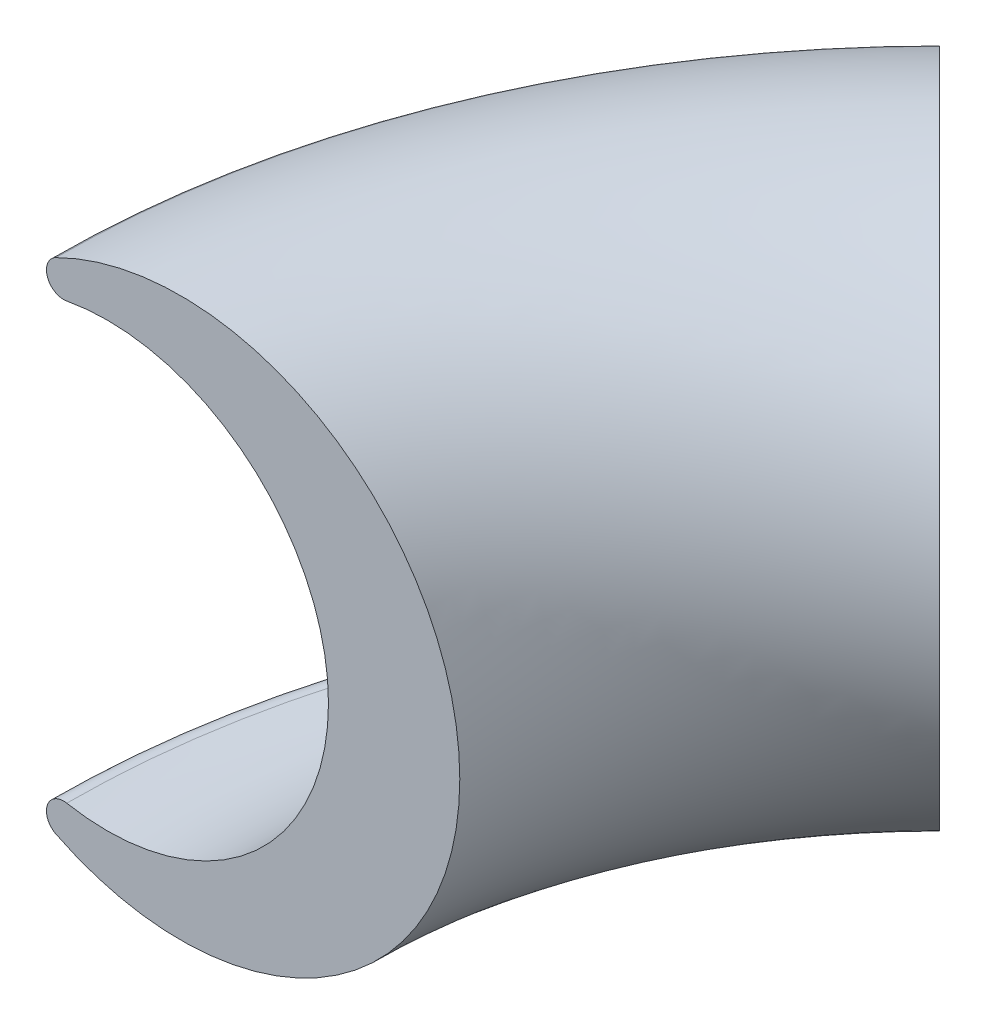
ISO-10303-21;
HEADER;
FILE_DESCRIPTION(('STEP AP214'),'2;1');
FILE_NAME('part.step','',(''),(''),'','','');
FILE_SCHEMA(('AUTOMOTIVE_DESIGN { 1 0 10303 214 1 1 1 1 }'));
ENDSEC;
DATA;
#1=APPLICATION_CONTEXT('core data for automotive mechanical design processes');
#2=APPLICATION_PROTOCOL_DEFINITION('international standard','automotive_design',2000,#1);
#3=PRODUCT_CONTEXT('',#1,'mechanical');
#4=PRODUCT('Part','Part','',(#3));
#5=PRODUCT_RELATED_PRODUCT_CATEGORY('part','',(#4));
#6=PRODUCT_DEFINITION_FORMATION('','',#4);
#7=PRODUCT_DEFINITION_CONTEXT('part definition',#1,'design');
#8=PRODUCT_DEFINITION('design','',#6,#7);
#9=PRODUCT_DEFINITION_SHAPE('','',#8);
#10=(LENGTH_UNIT() NAMED_UNIT(*) SI_UNIT(.MILLI.,.METRE.));
#11=(NAMED_UNIT(*) PLANE_ANGLE_UNIT() SI_UNIT($,.RADIAN.));
#12=(NAMED_UNIT(*) SI_UNIT($,.STERADIAN.) SOLID_ANGLE_UNIT());
#13=UNCERTAINTY_MEASURE_WITH_UNIT(LENGTH_MEASURE(1.E-05),#10,'distance_accuracy_value','');
#14=(GEOMETRIC_REPRESENTATION_CONTEXT(3) GLOBAL_UNCERTAINTY_ASSIGNED_CONTEXT((#13)) GLOBAL_UNIT_ASSIGNED_CONTEXT((#10,
#11,#12)) REPRESENTATION_CONTEXT('',''));
#15=CARTESIAN_POINT('',(0.,0.,0.));
#16=DIRECTION('',(0.,0.,1.));
#17=DIRECTION('',(1.,0.,0.));
#18=AXIS2_PLACEMENT_3D('',#15,#16,#17);
#19=CARTESIAN_POINT('',(6.5405,0.,0.));
#20=DIRECTION('',(0.,0.,1.));
#21=DIRECTION('',(1.,0.,0.));
#22=AXIS2_PLACEMENT_3D('',#19,#20,#21);
#23=PLANE('',#22);
#24=CARTESIAN_POINT('',(7.493,0.,0.));
#25=DIRECTION('',(0.,0.,1.));
#26=DIRECTION('',(1.,0.,0.));
#27=AXIS2_PLACEMENT_3D('',#24,#25,#26);
#28=CIRCLE('',#27,7.23955181390722);
#29=CARTESIAN_POINT('',(4.25524279646333,6.47518638783423,0.));
#30=VERTEX_POINT('',#29);
#31=CARTESIAN_POINT('',(4.25524279646331,-6.47518638783423,0.));
#32=VERTEX_POINT('',#31);
#33=EDGE_CURVE('E92',#30,#32,#28,.F.);
#34=ORIENTED_EDGE('',*,*,#33,.F.);
#35=CARTESIAN_POINT('',(4.45403729562105,6.07761752951579,0.));
#36=DIRECTION('',(0.,0.,1.));
#37=DIRECTION('',(1.,0.,0.));
#38=AXIS2_PLACEMENT_3D('',#35,#36,#37);
#39=CIRCLE('',#38,0.4445);
#40=CARTESIAN_POINT('',(4.53556522479152,5.64065821016766,0.));
#41=VERTEX_POINT('',#40);
#42=EDGE_CURVE('E48',#30,#41,#39,.T.);
#43=ORIENTED_EDGE('',*,*,#42,.T.);
#44=CARTESIAN_POINT('',(5.588,0.,0.));
#45=DIRECTION('',(0.,0.,1.));
#46=DIRECTION('',(1.,0.,0.));
#47=AXIS2_PLACEMENT_3D('',#44,#45,#46);
#48=CIRCLE('',#47,5.738);
#49=CARTESIAN_POINT('',(11.326,0.,0.));
#50=VERTEX_POINT('',#49);
#51=EDGE_CURVE('E91',#50,#41,#48,.T.);
#52=ORIENTED_EDGE('',*,*,#51,.F.);
#53=CARTESIAN_POINT('',(5.588,0.,0.));
#54=DIRECTION('',(0.,0.,-1.));
#55=DIRECTION('',(-1.,0.,0.));
#56=AXIS2_PLACEMENT_3D('',#53,#54,#55);
#57=CIRCLE('',#56,5.738);
#58=CARTESIAN_POINT('',(4.5355652247915,-5.64065821016766,0.));
#59=VERTEX_POINT('',#58);
#60=EDGE_CURVE('E85',#59,#50,#57,.F.);
#61=ORIENTED_EDGE('',*,*,#60,.F.);
#62=CARTESIAN_POINT('',(4.45403729562103,-6.07761752951578,0.));
#63=DIRECTION('',(0.,0.,1.));
#64=DIRECTION('',(1.,0.,0.));
#65=AXIS2_PLACEMENT_3D('',#62,#63,#64);
#66=CIRCLE('',#65,0.4445);
#67=EDGE_CURVE('E60',#59,#32,#66,.T.);
#68=ORIENTED_EDGE('',*,*,#67,.T.);
#69=EDGE_LOOP('',(#34,#43,#52,#61,#68));
#70=FACE_BOUND('',#69,.T.);
#71=ADVANCED_FACE('F39',(#70),#23,.T.);
#72=CARTESIAN_POINT('',(12.5850838032625,0.,-14.5929161967373));
#73=DIRECTION('',(-0.707106781186544,0.,0.707106781186551));
#74=DIRECTION('',(0.707106781186551,0.,0.707106781186544));
#75=AXIS2_PLACEMENT_3D('',#72,#73,#74);
#76=PLANE('',#75);
#77=CARTESIAN_POINT('',(11.9115645941824,0.,-15.2664354058175));
#78=DIRECTION('',(-0.707106781186544,0.,0.707106781186551));
#79=DIRECTION('',(0.707106781186551,0.,0.707106781186544));
#80=AXIS2_PLACEMENT_3D('',#77,#78,#79);
#81=CIRCLE('',#80,5.738);
#82=CARTESIAN_POINT('',(15.9689433046308,0.,-11.2090566953691));
#83=VERTEX_POINT('',#82);
#84=CARTESIAN_POINT('',(11.1673808278759,5.64065821016766,-16.0106191721239));
#85=VERTEX_POINT('',#84);
#86=EDGE_CURVE('E105',#83,#85,#81,.T.);
#87=ORIENTED_EDGE('',*,*,#86,.T.);
#88=CARTESIAN_POINT('',(11.1097318763034,6.07761752951579,-16.0682681236965));
#89=DIRECTION('',(-0.707106781186544,0.,0.707106781186551));
#90=DIRECTION('',(0.707106781186551,0.,0.707106781186544));
#91=AXIS2_PLACEMENT_3D('',#88,#89,#90);
#92=CIRCLE('',#91,0.4445);
#93=CARTESIAN_POINT('',(10.9691629378864,6.47518638783426,-16.2088370621135));
#94=VERTEX_POINT('',#93);
#95=EDGE_CURVE('E120',#85,#94,#92,.F.);
#96=ORIENTED_EDGE('',*,*,#95,.T.);
#97=CARTESIAN_POINT('',(13.2586030123427,0.,-13.9193969876571));
#98=DIRECTION('',(-0.707106781186544,0.,0.707106781186551));
#99=DIRECTION('',(0.707106781186551,0.,0.707106781186544));
#100=AXIS2_PLACEMENT_3D('',#97,#98,#99);
#101=CIRCLE('',#100,7.23955181390722);
#102=CARTESIAN_POINT('',(10.9691629378863,-6.47518638783423,-16.2088370621135));
#103=VERTEX_POINT('',#102);
#104=EDGE_CURVE('E100',#94,#103,#101,.F.);
#105=ORIENTED_EDGE('',*,*,#104,.T.);
#106=CARTESIAN_POINT('',(11.1097318763033,-6.07761752951578,-16.0682681236965));
#107=DIRECTION('',(-0.707106781186544,0.,0.707106781186551));
#108=DIRECTION('',(0.707106781186551,0.,0.707106781186544));
#109=AXIS2_PLACEMENT_3D('',#106,#107,#108);
#110=CIRCLE('',#109,0.4445);
#111=CARTESIAN_POINT('',(11.1673808278759,-5.64065821016766,-16.0106191721239));
#112=VERTEX_POINT('',#111);
#113=EDGE_CURVE('E117',#103,#112,#110,.F.);
#114=ORIENTED_EDGE('',*,*,#113,.T.);
#115=CARTESIAN_POINT('',(11.9115645941824,0.,-15.2664354058175));
#116=DIRECTION('',(0.707106781186544,0.,-0.707106781186551));
#117=DIRECTION('',(-0.707106781186551,0.,-0.707106781186544));
#118=AXIS2_PLACEMENT_3D('',#115,#116,#117);
#119=CIRCLE('',#118,5.738);
#120=EDGE_CURVE('E107',#112,#83,#119,.F.);
#121=ORIENTED_EDGE('',*,*,#120,.T.);
#122=EDGE_LOOP('',(#87,#96,#105,#114,#121));
#123=FACE_BOUND('',#122,.T.);
#124=ADVANCED_FACE('F143',(#123),#76,.F.);
#125=CARTESIAN_POINT('',(27.178,0.,0.));
#126=DIRECTION('',(0.,-1.,0.));
#127=DIRECTION('',(0.,0.,-1.));
#128=AXIS2_PLACEMENT_3D('',#125,#126,#127);
#129=TOROIDAL_SURFACE('',#128,19.685,7.23955181390722);
#130=ORIENTED_EDGE('',*,*,#104,.F.);
#131=CARTESIAN_POINT('',(27.178,6.47518638783426,0.));
#132=DIRECTION('',(0.,-1.,0.));
#133=DIRECTION('',(0.,0.,-1.));
#134=AXIS2_PLACEMENT_3D('',#131,#132,#133);
#135=CIRCLE('',#134,22.9227572035367);
#136=EDGE_CURVE('E127',#94,#30,#135,.F.);
#137=ORIENTED_EDGE('',*,*,#136,.T.);
#138=ORIENTED_EDGE('',*,*,#33,.T.);
#139=CARTESIAN_POINT('',(27.178,-6.47518638783426,0.));
#140=DIRECTION('',(0.,1.,0.));
#141=DIRECTION('',(0.,0.,1.));
#142=AXIS2_PLACEMENT_3D('',#139,#140,#141);
#143=CIRCLE('',#142,22.9227572035367);
#144=EDGE_CURVE('E123',#32,#103,#143,.F.);
#145=ORIENTED_EDGE('',*,*,#144,.T.);
#146=EDGE_LOOP('',(#130,#137,#138,#145));
#147=FACE_BOUND('',#146,.T.);
#148=ADVANCED_FACE('F135',(#147),#129,.T.);
#149=CARTESIAN_POINT('',(27.178,0.,0.));
#150=DIRECTION('',(0.,-1.,0.));
#151=DIRECTION('',(0.,0.,-1.));
#152=AXIS2_PLACEMENT_3D('',#149,#150,#151);
#153=TOROIDAL_SURFACE('',#152,21.59,5.738);
#154=ORIENTED_EDGE('',*,*,#120,.F.);
#155=CARTESIAN_POINT('',(27.178,-5.64065821016772,0.));
#156=DIRECTION('',(0.,1.,0.));
#157=DIRECTION('',(0.,0.,1.));
#158=AXIS2_PLACEMENT_3D('',#155,#156,#157);
#159=CIRCLE('',#158,22.6424347752085);
#160=EDGE_CURVE('E11',#112,#59,#159,.T.);
#161=ORIENTED_EDGE('',*,*,#160,.T.);
#162=ORIENTED_EDGE('',*,*,#60,.T.);
#163=CARTESIAN_POINT('',(27.178,0.,0.));
#164=DIRECTION('',(0.,-1.,0.));
#165=DIRECTION('',(-1.,0.,0.));
#166=AXIS2_PLACEMENT_3D('',#163,#164,#165);
#167=CIRCLE('',#166,15.852);
#168=EDGE_CURVE('E89',#50,#83,#167,.T.);
#169=ORIENTED_EDGE('',*,*,#168,.T.);
#170=EDGE_LOOP('',(#154,#161,#162,#169));
#171=FACE_BOUND('',#170,.T.);
#172=ADVANCED_FACE('F87',(#171),#153,.F.);
#173=CARTESIAN_POINT('',(27.178,0.,0.));
#174=DIRECTION('',(0.,-1.,0.));
#175=DIRECTION('',(0.,0.,-1.));
#176=AXIS2_PLACEMENT_3D('',#173,#174,#175);
#177=TOROIDAL_SURFACE('',#176,21.59,5.738);
#178=ORIENTED_EDGE('',*,*,#51,.T.);
#179=CARTESIAN_POINT('',(27.178,5.64065821016807,0.));
#180=DIRECTION('',(0.,-1.,0.));
#181=DIRECTION('',(0.,0.,-1.));
#182=AXIS2_PLACEMENT_3D('',#179,#180,#181);
#183=CIRCLE('',#182,22.6424347752086);
#184=EDGE_CURVE('E111',#41,#85,#183,.T.);
#185=ORIENTED_EDGE('',*,*,#184,.T.);
#186=ORIENTED_EDGE('',*,*,#86,.F.);
#187=ORIENTED_EDGE('',*,*,#168,.F.);
#188=EDGE_LOOP('',(#178,#185,#186,#187));
#189=FACE_BOUND('',#188,.T.);
#190=ADVANCED_FACE('F103',(#189),#177,.F.);
#191=CARTESIAN_POINT('',(27.178,6.07761752951579,0.));
#192=DIRECTION('',(0.,1.,0.));
#193=DIRECTION('',(0.,0.,1.));
#194=AXIS2_PLACEMENT_3D('',#191,#192,#193);
#195=TOROIDAL_SURFACE('',#194,22.723962704379,0.4445);
#196=ORIENTED_EDGE('',*,*,#42,.F.);
#197=ORIENTED_EDGE('',*,*,#136,.F.);
#198=ORIENTED_EDGE('',*,*,#95,.F.);
#199=ORIENTED_EDGE('',*,*,#184,.F.);
#200=EDGE_LOOP('',(#196,#197,#198,#199));
#201=FACE_BOUND('',#200,.T.);
#202=ADVANCED_FACE('F141',(#201),#195,.T.);
#203=CARTESIAN_POINT('',(27.178,-6.07761752951578,0.));
#204=DIRECTION('',(0.,1.,0.));
#205=DIRECTION('',(0.,0.,1.));
#206=AXIS2_PLACEMENT_3D('',#203,#204,#205);
#207=TOROIDAL_SURFACE('',#206,22.723962704379,0.4445);
#208=ORIENTED_EDGE('',*,*,#67,.F.);
#209=ORIENTED_EDGE('',*,*,#160,.F.);
#210=ORIENTED_EDGE('',*,*,#113,.F.);
#211=ORIENTED_EDGE('',*,*,#144,.F.);
#212=EDGE_LOOP('',(#208,#209,#210,#211));
#213=FACE_BOUND('',#212,.T.);
#214=ADVANCED_FACE('F41',(#213),#207,.T.);
#215=CLOSED_SHELL('',(#71,#124,#148,#172,#190,#202,#214));
#216=MANIFOLD_SOLID_BREP('B2',#215);
#217=ADVANCED_BREP_SHAPE_REPRESENTATION('',(#18,#216),#14);
#218=SHAPE_DEFINITION_REPRESENTATION(#9,#217);
ENDSEC;
END-ISO-10303-21;
